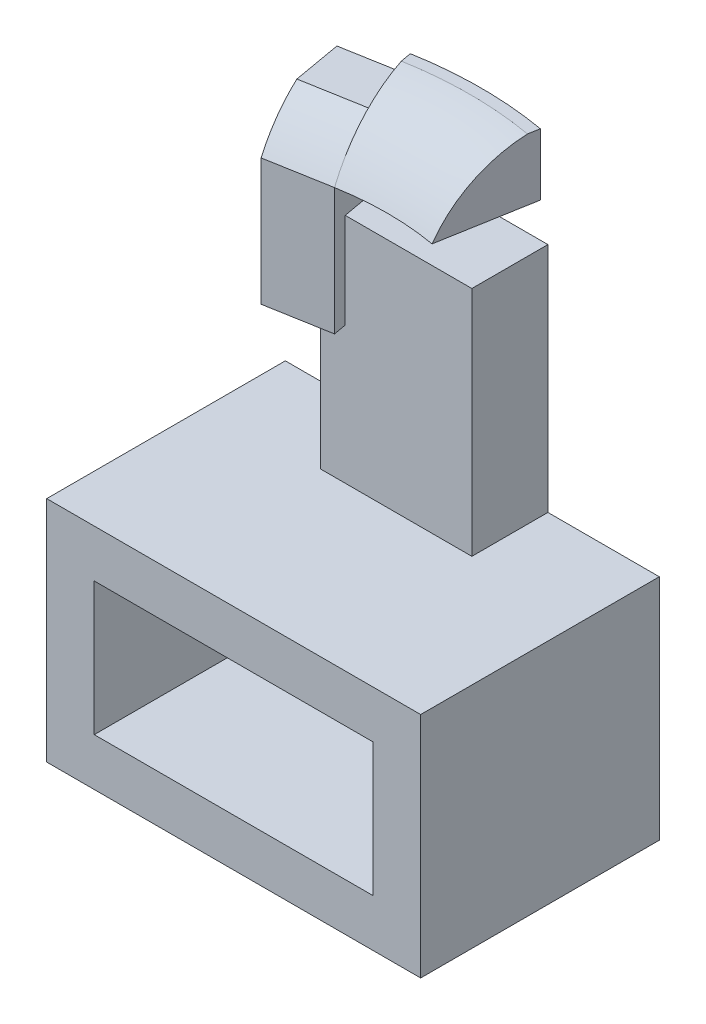
ISO-10303-21;
HEADER;
FILE_DESCRIPTION(('STEP AP214'),'2;1');
FILE_NAME('part.step','',(''),(''),'','','');
FILE_SCHEMA(('AUTOMOTIVE_DESIGN { 1 0 10303 214 1 1 1 1 }'));
ENDSEC;
DATA;
#1=APPLICATION_CONTEXT('core data for automotive mechanical design processes');
#2=APPLICATION_PROTOCOL_DEFINITION('international standard','automotive_design',2000,#1);
#3=PRODUCT_CONTEXT('',#1,'mechanical');
#4=PRODUCT('Part','Part','',(#3));
#5=PRODUCT_RELATED_PRODUCT_CATEGORY('part','',(#4));
#6=PRODUCT_DEFINITION_FORMATION('','',#4);
#7=PRODUCT_DEFINITION_CONTEXT('part definition',#1,'design');
#8=PRODUCT_DEFINITION('design','',#6,#7);
#9=PRODUCT_DEFINITION_SHAPE('','',#8);
#10=(LENGTH_UNIT() NAMED_UNIT(*) SI_UNIT(.MILLI.,.METRE.));
#11=(NAMED_UNIT(*) PLANE_ANGLE_UNIT() SI_UNIT($,.RADIAN.));
#12=(NAMED_UNIT(*) SI_UNIT($,.STERADIAN.) SOLID_ANGLE_UNIT());
#13=UNCERTAINTY_MEASURE_WITH_UNIT(LENGTH_MEASURE(1.E-05),#10,'distance_accuracy_value','');
#14=(GEOMETRIC_REPRESENTATION_CONTEXT(3) GLOBAL_UNCERTAINTY_ASSIGNED_CONTEXT((#13)) GLOBAL_UNIT_ASSIGNED_CONTEXT((#10,
#11,#12)) REPRESENTATION_CONTEXT('',''));
#15=CARTESIAN_POINT('',(0.,0.,0.));
#16=DIRECTION('',(0.,0.,1.));
#17=DIRECTION('',(1.,0.,0.));
#18=AXIS2_PLACEMENT_3D('',#15,#16,#17);
#19=CARTESIAN_POINT('',(0.,0.,-5.));
#20=DIRECTION('',(0.,0.,1.));
#21=DIRECTION('',(1.,0.,0.));
#22=AXIS2_PLACEMENT_3D('',#19,#20,#21);
#23=PLANE('',#22);
#24=DIRECTION('',(-1.,0.,0.));
#25=VECTOR('',#24,1.);
#26=CARTESIAN_POINT('',(0.,39.6,-5.));
#27=LINE('',#26,#25);
#28=CARTESIAN_POINT('',(-10.1705402472643,39.6,-5.));
#29=VERTEX_POINT('',#28);
#30=CARTESIAN_POINT('',(-11.927556156706,39.6,-5.));
#31=VERTEX_POINT('',#30);
#32=EDGE_CURVE('E312',#29,#31,#27,.T.);
#33=ORIENTED_EDGE('',*,*,#32,.F.);
#34=DIRECTION('',(0.,-1.,0.));
#35=VECTOR('',#34,1.);
#36=CARTESIAN_POINT('',(-10.1705402472643,0.,-5.));
#37=LINE('',#36,#35);
#38=CARTESIAN_POINT('',(-10.1705402472643,54.6,-5.));
#39=VERTEX_POINT('',#38);
#40=EDGE_CURVE('E308',#39,#29,#37,.T.);
#41=ORIENTED_EDGE('',*,*,#40,.F.);
#42=DIRECTION('',(-1.,0.,0.));
#43=VECTOR('',#42,1.);
#44=CARTESIAN_POINT('',(11.927556156706,54.6,-5.00000000000001));
#45=LINE('',#44,#43);
#46=CARTESIAN_POINT('',(11.927556156706,54.6,-5.00000000000001));
#47=VERTEX_POINT('',#46);
#48=EDGE_CURVE('E320',#47,#39,#45,.T.);
#49=ORIENTED_EDGE('',*,*,#48,.F.);
#50=DIRECTION('',(0.,-1.,0.));
#51=VECTOR('',#50,1.);
#52=CARTESIAN_POINT('',(11.927556156706,54.6,-5.00000000000001));
#53=LINE('',#52,#51);
#54=CARTESIAN_POINT('',(11.927556156706,18.,-5.));
#55=VERTEX_POINT('',#54);
#56=EDGE_CURVE('E330',#47,#55,#53,.T.);
#57=ORIENTED_EDGE('',*,*,#56,.T.);
#58=DIRECTION('',(1.,0.,0.));
#59=VECTOR('',#58,1.);
#60=CARTESIAN_POINT('',(0.,18.,-5.));
#61=LINE('',#60,#59);
#62=CARTESIAN_POINT('',(29.5,18.,-5.));
#63=VERTEX_POINT('',#62);
#64=EDGE_CURVE('E342',#55,#63,#61,.T.);
#65=ORIENTED_EDGE('',*,*,#64,.T.);
#66=DIRECTION('',(0.,-1.,0.));
#67=VECTOR('',#66,1.);
#68=CARTESIAN_POINT('',(29.5,0.,-5.));
#69=LINE('',#68,#67);
#70=CARTESIAN_POINT('',(29.5,-18.,-5.));
#71=VERTEX_POINT('',#70);
#72=EDGE_CURVE('E339',#63,#71,#69,.T.);
#73=ORIENTED_EDGE('',*,*,#72,.T.);
#74=DIRECTION('',(1.,0.,0.));
#75=VECTOR('',#74,1.);
#76=CARTESIAN_POINT('',(0.,-18.,-5.));
#77=LINE('',#76,#75);
#78=CARTESIAN_POINT('',(-29.5,-18.,-5.));
#79=VERTEX_POINT('',#78);
#80=EDGE_CURVE('E349',#79,#71,#77,.T.);
#81=ORIENTED_EDGE('',*,*,#80,.F.);
#82=DIRECTION('',(0.,-1.,0.));
#83=VECTOR('',#82,1.);
#84=CARTESIAN_POINT('',(-29.5,0.,-5.));
#85=LINE('',#84,#83);
#86=CARTESIAN_POINT('',(-29.5,18.,-5.));
#87=VERTEX_POINT('',#86);
#88=EDGE_CURVE('E346',#87,#79,#85,.T.);
#89=ORIENTED_EDGE('',*,*,#88,.F.);
#90=CARTESIAN_POINT('',(-11.927556156706,18.,-5.));
#91=VERTEX_POINT('',#90);
#92=EDGE_CURVE('E343',#87,#91,#61,.T.);
#93=ORIENTED_EDGE('',*,*,#92,.T.);
#94=DIRECTION('',(0.,-1.,0.));
#95=VECTOR('',#94,1.);
#96=CARTESIAN_POINT('',(-11.927556156706,54.6,-5.));
#97=LINE('',#96,#95);
#98=EDGE_CURVE('E323',#31,#91,#97,.T.);
#99=ORIENTED_EDGE('',*,*,#98,.F.);
#100=EDGE_LOOP('',(#33,#41,#49,#57,#65,#73,#81,#89,#93,#99));
#101=FACE_BOUND('',#100,.T.);
#102=ADVANCED_FACE('F37',(#101),#23,.F.);
#103=CARTESIAN_POINT('',(-11.927556156706,54.6,7.));
#104=DIRECTION('',(1.,0.,0.));
#105=DIRECTION('',(0.,0.,-1.));
#106=AXIS2_PLACEMENT_3D('',#103,#104,#105);
#107=PLANE('',#106);
#108=DIRECTION('',(0.,0.,1.));
#109=VECTOR('',#108,1.);
#110=CARTESIAN_POINT('',(-11.927556156706,39.6,7.));
#111=LINE('',#110,#109);
#112=CARTESIAN_POINT('',(-11.927556156706,39.6,7.));
#113=VERTEX_POINT('',#112);
#114=EDGE_CURVE('E310',#31,#113,#111,.T.);
#115=ORIENTED_EDGE('',*,*,#114,.F.);
#116=ORIENTED_EDGE('',*,*,#98,.T.);
#117=DIRECTION('',(0.,0.,1.));
#118=VECTOR('',#117,1.);
#119=CARTESIAN_POINT('',(-11.927556156706,18.,7.));
#120=LINE('',#119,#118);
#121=CARTESIAN_POINT('',(-11.927556156706,18.,7.));
#122=VERTEX_POINT('',#121);
#123=EDGE_CURVE('E314',#91,#122,#120,.T.);
#124=ORIENTED_EDGE('',*,*,#123,.T.);
#125=DIRECTION('',(0.,-1.,0.));
#126=VECTOR('',#125,1.);
#127=CARTESIAN_POINT('',(-11.927556156706,54.6,7.));
#128=LINE('',#127,#126);
#129=EDGE_CURVE('E336',#113,#122,#128,.T.);
#130=ORIENTED_EDGE('',*,*,#129,.F.);
#131=EDGE_LOOP('',(#115,#116,#124,#130));
#132=FACE_BOUND('',#131,.T.);
#133=ADVANCED_FACE('F392',(#132),#107,.F.);
#134=CARTESIAN_POINT('',(11.927556156706,54.6,6.99999999999999));
#135=DIRECTION('',(0.,0.,-1.));
#136=DIRECTION('',(-1.,0.,0.));
#137=AXIS2_PLACEMENT_3D('',#134,#135,#136);
#138=PLANE('',#137);
#139=DIRECTION('',(1.,0.,0.));
#140=VECTOR('',#139,1.);
#141=CARTESIAN_POINT('',(11.927556156706,39.6,6.99999999999999));
#142=LINE('',#141,#140);
#143=CARTESIAN_POINT('',(-8.0546164787627,39.6,7.));
#144=VERTEX_POINT('',#143);
#145=EDGE_CURVE('E45',#113,#144,#142,.T.);
#146=ORIENTED_EDGE('',*,*,#145,.F.);
#147=ORIENTED_EDGE('',*,*,#129,.T.);
#148=DIRECTION('',(1.,0.,0.));
#149=VECTOR('',#148,1.);
#150=CARTESIAN_POINT('',(11.927556156706,18.,6.99999999999999));
#151=LINE('',#150,#149);
#152=CARTESIAN_POINT('',(11.927556156706,18.,6.99999999999999));
#153=VERTEX_POINT('',#152);
#154=EDGE_CURVE('E325',#122,#153,#151,.T.);
#155=ORIENTED_EDGE('',*,*,#154,.T.);
#156=DIRECTION('',(0.,-1.,0.));
#157=VECTOR('',#156,1.);
#158=CARTESIAN_POINT('',(11.927556156706,54.6,6.99999999999999));
#159=LINE('',#158,#157);
#160=CARTESIAN_POINT('',(11.927556156706,54.6,6.99999999999999));
#161=VERTEX_POINT('',#160);
#162=EDGE_CURVE('E333',#161,#153,#159,.T.);
#163=ORIENTED_EDGE('',*,*,#162,.F.);
#164=DIRECTION('',(1.,0.,0.));
#165=VECTOR('',#164,1.);
#166=CARTESIAN_POINT('',(11.927556156706,54.6,6.99999999999999));
#167=LINE('',#166,#165);
#168=CARTESIAN_POINT('',(-8.0546164787627,54.6,7.));
#169=VERTEX_POINT('',#168);
#170=EDGE_CURVE('E315',#169,#161,#167,.T.);
#171=ORIENTED_EDGE('',*,*,#170,.F.);
#172=DIRECTION('',(0.,1.,0.));
#173=VECTOR('',#172,1.);
#174=CARTESIAN_POINT('',(-8.05461647876271,54.6,7.));
#175=LINE('',#174,#173);
#176=EDGE_CURVE('E306',#144,#169,#175,.T.);
#177=ORIENTED_EDGE('',*,*,#176,.F.);
#178=EDGE_LOOP('',(#146,#147,#155,#163,#171,#177));
#179=FACE_BOUND('',#178,.T.);
#180=ADVANCED_FACE('F379',(#179),#138,.F.);
#181=CARTESIAN_POINT('',(0.,54.6,0.));
#182=DIRECTION('',(0.,1.,0.));
#183=DIRECTION('',(0.,0.,1.));
#184=AXIS2_PLACEMENT_3D('',#181,#182,#183);
#185=PLANE('',#184);
#186=ORIENTED_EDGE('',*,*,#48,.T.);
#187=DIRECTION('',(0.173648177666931,0.,0.984807753012208));
#188=VECTOR('',#187,1.);
#189=CARTESIAN_POINT('',(-9.00881057519814,54.6,1.58849636849918));
#190=LINE('',#189,#188);
#191=EDGE_CURVE('E363',#39,#169,#190,.T.);
#192=ORIENTED_EDGE('',*,*,#191,.T.);
#193=ORIENTED_EDGE('',*,*,#170,.T.);
#194=DIRECTION('',(0.,0.,-1.));
#195=VECTOR('',#194,1.);
#196=CARTESIAN_POINT('',(11.927556156706,54.6,6.99999999999999));
#197=LINE('',#196,#195);
#198=EDGE_CURVE('E317',#161,#47,#197,.T.);
#199=ORIENTED_EDGE('',*,*,#198,.T.);
#200=EDGE_LOOP('',(#186,#192,#193,#199));
#201=FACE_BOUND('',#200,.T.);
#202=ADVANCED_FACE('F383',(#201),#185,.T.);
#203=CARTESIAN_POINT('',(-29.5,18.,10.));
#204=DIRECTION('',(0.,-1.,0.));
#205=DIRECTION('',(0.,0.,-1.));
#206=AXIS2_PLACEMENT_3D('',#203,#204,#205);
#207=PLANE('',#206);
#208=ORIENTED_EDGE('',*,*,#92,.F.);
#209=DIRECTION('',(0.,0.,-1.));
#210=VECTOR('',#209,1.);
#211=CARTESIAN_POINT('',(-29.5,18.,10.));
#212=LINE('',#211,#210);
#213=CARTESIAN_POINT('',(-29.5,18.,32.65));
#214=VERTEX_POINT('',#213);
#215=EDGE_CURVE('E197',#214,#87,#212,.T.);
#216=ORIENTED_EDGE('',*,*,#215,.F.);
#217=DIRECTION('',(1.,0.,0.));
#218=VECTOR('',#217,1.);
#219=CARTESIAN_POINT('',(0.,18.,32.65));
#220=LINE('',#219,#218);
#221=CARTESIAN_POINT('',(29.5,18.,32.65));
#222=VERTEX_POINT('',#221);
#223=EDGE_CURVE('E223',#214,#222,#220,.T.);
#224=ORIENTED_EDGE('',*,*,#223,.T.);
#225=DIRECTION('',(0.,0.,-1.));
#226=VECTOR('',#225,1.);
#227=CARTESIAN_POINT('',(29.5,18.,10.));
#228=LINE('',#227,#226);
#229=EDGE_CURVE('E357',#222,#63,#228,.T.);
#230=ORIENTED_EDGE('',*,*,#229,.T.);
#231=ORIENTED_EDGE('',*,*,#64,.F.);
#232=DIRECTION('',(0.,0.,-1.));
#233=VECTOR('',#232,1.);
#234=CARTESIAN_POINT('',(11.927556156706,18.,6.99999999999999));
#235=LINE('',#234,#233);
#236=EDGE_CURVE('E318',#153,#55,#235,.T.);
#237=ORIENTED_EDGE('',*,*,#236,.F.);
#238=ORIENTED_EDGE('',*,*,#154,.F.);
#239=ORIENTED_EDGE('',*,*,#123,.F.);
#240=EDGE_LOOP('',(#208,#216,#224,#230,#231,#237,#238,#239));
#241=FACE_BOUND('',#240,.T.);
#242=ADVANCED_FACE('F397',(#241),#207,.F.);
#243=CARTESIAN_POINT('',(-29.5,18.,10.));
#244=DIRECTION('',(1.,0.,0.));
#245=DIRECTION('',(0.,1.,0.));
#246=AXIS2_PLACEMENT_3D('',#243,#244,#245);
#247=PLANE('',#246);
#248=ORIENTED_EDGE('',*,*,#88,.T.);
#249=DIRECTION('',(0.,0.,-1.));
#250=VECTOR('',#249,1.);
#251=CARTESIAN_POINT('',(-29.5,-18.,10.));
#252=LINE('',#251,#250);
#253=CARTESIAN_POINT('',(-29.5,-18.,32.65));
#254=VERTEX_POINT('',#253);
#255=EDGE_CURVE('E361',#254,#79,#252,.T.);
#256=ORIENTED_EDGE('',*,*,#255,.F.);
#257=DIRECTION('',(0.,1.,0.));
#258=VECTOR('',#257,1.);
#259=CARTESIAN_POINT('',(-29.5,0.,32.65));
#260=LINE('',#259,#258);
#261=EDGE_CURVE('E220',#254,#214,#260,.T.);
#262=ORIENTED_EDGE('',*,*,#261,.T.);
#263=ORIENTED_EDGE('',*,*,#215,.T.);
#264=EDGE_LOOP('',(#248,#256,#262,#263));
#265=FACE_BOUND('',#264,.T.);
#266=ADVANCED_FACE('F39',(#265),#247,.F.);
#267=CARTESIAN_POINT('',(-29.5,-18.,10.));
#268=DIRECTION('',(0.,1.,0.));
#269=DIRECTION('',(0.,0.,1.));
#270=AXIS2_PLACEMENT_3D('',#267,#268,#269);
#271=PLANE('',#270);
#272=ORIENTED_EDGE('',*,*,#80,.T.);
#273=DIRECTION('',(0.,0.,-1.));
#274=VECTOR('',#273,1.);
#275=CARTESIAN_POINT('',(29.5,-18.,10.));
#276=LINE('',#275,#274);
#277=CARTESIAN_POINT('',(29.5,-18.,32.65));
#278=VERTEX_POINT('',#277);
#279=EDGE_CURVE('E359',#278,#71,#276,.T.);
#280=ORIENTED_EDGE('',*,*,#279,.F.);
#281=DIRECTION('',(-1.,0.,0.));
#282=VECTOR('',#281,1.);
#283=CARTESIAN_POINT('',(0.,-18.,32.65));
#284=LINE('',#283,#282);
#285=EDGE_CURVE('E217',#278,#254,#284,.T.);
#286=ORIENTED_EDGE('',*,*,#285,.T.);
#287=ORIENTED_EDGE('',*,*,#255,.T.);
#288=EDGE_LOOP('',(#272,#280,#286,#287));
#289=FACE_BOUND('',#288,.T.);
#290=ADVANCED_FACE('F409',(#289),#271,.F.);
#291=CARTESIAN_POINT('',(29.5,18.,10.));
#292=DIRECTION('',(-1.,0.,0.));
#293=DIRECTION('',(0.,-1.,0.));
#294=AXIS2_PLACEMENT_3D('',#291,#292,#293);
#295=PLANE('',#294);
#296=ORIENTED_EDGE('',*,*,#72,.F.);
#297=ORIENTED_EDGE('',*,*,#229,.F.);
#298=DIRECTION('',(0.,-1.,0.));
#299=VECTOR('',#298,1.);
#300=CARTESIAN_POINT('',(29.5,0.,32.65));
#301=LINE('',#300,#299);
#302=EDGE_CURVE('E226',#222,#278,#301,.T.);
#303=ORIENTED_EDGE('',*,*,#302,.T.);
#304=ORIENTED_EDGE('',*,*,#279,.T.);
#305=EDGE_LOOP('',(#296,#297,#303,#304));
#306=FACE_BOUND('',#305,.T.);
#307=ADVANCED_FACE('F405',(#306),#295,.F.);
#308=CARTESIAN_POINT('',(11.927556156706,54.6,6.99999999999999));
#309=DIRECTION('',(-1.,0.,0.));
#310=DIRECTION('',(0.,0.,1.));
#311=AXIS2_PLACEMENT_3D('',#308,#309,#310);
#312=PLANE('',#311);
#313=ORIENTED_EDGE('',*,*,#236,.T.);
#314=ORIENTED_EDGE('',*,*,#56,.F.);
#315=ORIENTED_EDGE('',*,*,#198,.F.);
#316=ORIENTED_EDGE('',*,*,#162,.T.);
#317=EDGE_LOOP('',(#313,#314,#315,#316));
#318=FACE_BOUND('',#317,.T.);
#319=ADVANCED_FACE('F401',(#318),#312,.F.);
#320=CARTESIAN_POINT('',(-18.8568881053202,39.6,3.32497814516849));
#321=DIRECTION('',(0.,1.,0.));
#322=DIRECTION('',(0.,0.,1.));
#323=AXIS2_PLACEMENT_3D('',#320,#321,#322);
#324=PLANE('',#323);
#325=DIRECTION('',(0.173648177666931,0.,0.984807753012208));
#326=VECTOR('',#325,1.);
#327=CARTESIAN_POINT('',(-9.00881057519814,39.6,1.58849636849918));
#328=LINE('',#327,#326);
#329=CARTESIAN_POINT('',(-10.2547931321206,39.6,-5.47782185413595));
#330=VERTEX_POINT('',#329);
#331=EDGE_CURVE('E249',#330,#29,#328,.T.);
#332=ORIENTED_EDGE('',*,*,#331,.T.);
#333=ORIENTED_EDGE('',*,*,#32,.T.);
#334=ORIENTED_EDGE('',*,*,#114,.T.);
#335=ORIENTED_EDGE('',*,*,#145,.T.);
#336=CARTESIAN_POINT('',(-7.69348251153337,39.6,9.04809250279412));
#337=VERTEX_POINT('',#336);
#338=EDGE_CURVE('E233',#144,#337,#328,.T.);
#339=ORIENTED_EDGE('',*,*,#338,.T.);
#340=DIRECTION('',(0.984807753012208,0.,-0.173648177666931));
#341=VECTOR('',#340,1.);
#342=CARTESIAN_POINT('',(-17.5415600416555,39.6,10.7845742794634));
#343=LINE('',#342,#341);
#344=CARTESIAN_POINT('',(-17.5415600416555,39.6,10.7845742794634));
#345=VERTEX_POINT('',#344);
#346=EDGE_CURVE('E270',#345,#337,#343,.T.);
#347=ORIENTED_EDGE('',*,*,#346,.F.);
#348=DIRECTION('',(0.173648177666931,0.,0.984807753012208));
#349=VECTOR('',#348,1.);
#350=CARTESIAN_POINT('',(-18.8568881053202,39.6,3.32497814516849));
#351=LINE('',#350,#349);
#352=CARTESIAN_POINT('',(-20.1028706622427,39.6,-3.74134007746664));
#353=VERTEX_POINT('',#352);
#354=EDGE_CURVE('E234',#353,#345,#351,.T.);
#355=ORIENTED_EDGE('',*,*,#354,.F.);
#356=DIRECTION('',(0.984807753012208,0.,-0.173648177666931));
#357=VECTOR('',#356,1.);
#358=CARTESIAN_POINT('',(-20.1028706622427,39.6,-3.74134007746664));
#359=LINE('',#358,#357);
#360=EDGE_CURVE('E248',#353,#330,#359,.T.);
#361=ORIENTED_EDGE('',*,*,#360,.T.);
#362=EDGE_LOOP('',(#332,#333,#334,#335,#339,#347,#355,#361));
#363=FACE_BOUND('',#362,.T.);
#364=ADVANCED_FACE('F368',(#363),#324,.F.);
#365=CARTESIAN_POINT('',(-9.00881057519814,0.,1.58849636849918));
#366=DIRECTION('',(-0.984807753012208,0.,0.173648177666931));
#367=DIRECTION('',(0.173648177666931,0.,0.984807753012208));
#368=AXIS2_PLACEMENT_3D('',#365,#366,#367);
#369=PLANE('',#368);
#370=ORIENTED_EDGE('',*,*,#191,.F.);
#371=ORIENTED_EDGE('',*,*,#40,.T.);
#372=ORIENTED_EDGE('',*,*,#331,.F.);
#373=DIRECTION('',(0.,-1.,0.));
#374=VECTOR('',#373,1.);
#375=CARTESIAN_POINT('',(-10.2547931321206,0.,-5.47782185413596));
#376=LINE('',#375,#374);
#377=CARTESIAN_POINT('',(-10.2547931321206,59.6,-5.47782185413595));
#378=VERTEX_POINT('',#377);
#379=EDGE_CURVE('E238',#378,#330,#376,.T.);
#380=ORIENTED_EDGE('',*,*,#379,.F.);
#381=DIRECTION('',(-0.173648177666931,0.,-0.984807753012208));
#382=VECTOR('',#381,1.);
#383=CARTESIAN_POINT('',(-10.2547931321206,59.6,-5.47782185413595));
#384=LINE('',#383,#382);
#385=CARTESIAN_POINT('',(-7.69348251153337,59.6,9.04809250279412));
#386=VERTEX_POINT('',#385);
#387=EDGE_CURVE('E295',#386,#378,#384,.T.);
#388=ORIENTED_EDGE('',*,*,#387,.F.);
#389=DIRECTION('',(0.,1.,0.));
#390=VECTOR('',#389,1.);
#391=CARTESIAN_POINT('',(-7.69348251153337,0.,9.04809250279412));
#392=LINE('',#391,#390);
#393=EDGE_CURVE('E252',#337,#386,#392,.T.);
#394=ORIENTED_EDGE('',*,*,#393,.F.);
#395=ORIENTED_EDGE('',*,*,#338,.F.);
#396=ORIENTED_EDGE('',*,*,#176,.T.);
#397=EDGE_LOOP('',(#370,#371,#372,#380,#388,#394,#395,#396));
#398=FACE_BOUND('',#397,.T.);
#399=ADVANCED_FACE('F376',(#398),#369,.F.);
#400=CARTESIAN_POINT('',(-10.6977316429036,50.0739583710066,-7.9898509775484));
#401=DIRECTION('',(-0.984807753012208,0.,0.173648177666931));
#402=DIRECTION('',(0.173648177666931,0.,0.984807753012208));
#403=AXIS2_PLACEMENT_3D('',#400,#401,#402);
#404=PLANE('',#403);
#405=DIRECTION('',(0.,1.,0.));
#406=VECTOR('',#405,1.);
#407=CARTESIAN_POINT('',(-10.2547931321206,59.6,-5.47782185413595));
#408=LINE('',#407,#406);
#409=CARTESIAN_POINT('',(-10.2547931321206,66.3439716286506,-5.47782185413595));
#410=VERTEX_POINT('',#409);
#411=CARTESIAN_POINT('',(-10.2547931321206,69.35,-5.47782185413595));
#412=VERTEX_POINT('',#411);
#413=EDGE_CURVE('E285',#410,#412,#408,.T.);
#414=ORIENTED_EDGE('',*,*,#413,.F.);
#415=DIRECTION('',(0.173648177666931,0.,0.984807753012208));
#416=VECTOR('',#415,1.);
#417=CARTESIAN_POINT('',(-9.00881057519814,66.3439716286506,1.58849636849918));
#418=LINE('',#417,#416);
#419=CARTESIAN_POINT('',(-8.90217330434275,66.3439716286506,2.19326638399495));
#420=VERTEX_POINT('',#419);
#421=EDGE_CURVE('E257',#410,#420,#418,.T.);
#422=ORIENTED_EDGE('',*,*,#421,.T.);
#423=CARTESIAN_POINT('',(-10.4653945744785,50.0885563828168,-6.67220198536581));
#424=DIRECTION('',(-0.984807753012208,0.,0.173648177666931));
#425=DIRECTION('',(0.173648177666931,0.,0.984807753012208));
#426=AXIS2_PLACEMENT_3D('',#423,#424,#425);
#427=CIRCLE('',#426,18.5816768608763);
#428=EDGE_CURVE('E254',#420,#386,#427,.F.);
#429=ORIENTED_EDGE('',*,*,#428,.T.);
#430=CARTESIAN_POINT('',(-10.6977316429036,50.0739583710066,-7.9898509775484));
#431=DIRECTION('',(0.984807753012208,0.,-0.173648177666931));
#432=DIRECTION('',(0.173648177666931,0.,0.984807753012208));
#433=AXIS2_PLACEMENT_3D('',#430,#431,#432);
#434=CIRCLE('',#433,19.75);
#435=CARTESIAN_POINT('',(-9.95090882120347,69.35,-3.75440828636459));
#436=VERTEX_POINT('',#435);
#437=EDGE_CURVE('E292',#436,#386,#434,.T.);
#438=ORIENTED_EDGE('',*,*,#437,.F.);
#439=DIRECTION('',(0.173648177666931,0.,0.984807753012208));
#440=VECTOR('',#439,1.);
#441=CARTESIAN_POINT('',(-10.2547931321206,69.35,-5.47782185413595));
#442=LINE('',#441,#440);
#443=EDGE_CURVE('E289',#412,#436,#442,.T.);
#444=ORIENTED_EDGE('',*,*,#443,.F.);
#445=EDGE_LOOP('',(#414,#422,#429,#438,#444));
#446=FACE_BOUND('',#445,.T.);
#447=ADVANCED_FACE('F587',(#446),#404,.T.);
#448=CARTESIAN_POINT('',(0.,-41.3962676693913,52.68));
#449=DIRECTION('',(0.,-1.,0.));
#450=DIRECTION('',(0.,0.,-1.));
#451=AXIS2_PLACEMENT_3D('',#448,#449,#450);
#452=CYLINDRICAL_SURFACE('',#451,59.055);
#453=CARTESIAN_POINT('',(0.,59.6,52.68));
#454=DIRECTION('',(0.,-1.,0.));
#455=DIRECTION('',(0.,0.,-1.));
#456=AXIS2_PLACEMENT_3D('',#453,#454,#455);
#457=CIRCLE('',#456,59.055);
#458=CARTESIAN_POINT('',(10.2547931321206,59.6,-5.47782185413595));
#459=VERTEX_POINT('',#458);
#460=EDGE_CURVE('E304',#378,#459,#457,.T.);
#461=ORIENTED_EDGE('',*,*,#460,.F.);
#462=EDGE_CURVE('E286',#378,#410,#408,.T.);
#463=ORIENTED_EDGE('',*,*,#462,.T.);
#464=ORIENTED_EDGE('',*,*,#413,.T.);
#465=CARTESIAN_POINT('',(0.,69.35,52.68));
#466=DIRECTION('',(0.,-1.,0.));
#467=DIRECTION('',(0.,0.,-1.));
#468=AXIS2_PLACEMENT_3D('',#465,#466,#467);
#469=CIRCLE('',#468,59.055);
#470=CARTESIAN_POINT('',(10.2547931321206,69.35,-5.47782185413595));
#471=VERTEX_POINT('',#470);
#472=EDGE_CURVE('E298',#412,#471,#469,.T.);
#473=ORIENTED_EDGE('',*,*,#472,.T.);
#474=DIRECTION('',(0.,1.,0.));
#475=VECTOR('',#474,1.);
#476=CARTESIAN_POINT('',(10.2547931321206,59.6,-5.47782185413595));
#477=LINE('',#476,#475);
#478=EDGE_CURVE('E273',#459,#471,#477,.T.);
#479=ORIENTED_EDGE('',*,*,#478,.F.);
#480=EDGE_LOOP('',(#461,#463,#464,#473,#479));
#481=FACE_BOUND('',#480,.T.);
#482=ADVANCED_FACE('F598',(#481),#452,.T.);
#483=CARTESIAN_POINT('',(-10.2547931321206,59.6,-5.47782185413595));
#484=DIRECTION('',(0.,-1.,0.));
#485=DIRECTION('',(0.,0.,-1.));
#486=AXIS2_PLACEMENT_3D('',#483,#484,#485);
#487=PLANE('',#486);
#488=CARTESIAN_POINT('',(0.,59.6,52.68));
#489=DIRECTION('',(0.,-1.,0.));
#490=DIRECTION('',(0.,0.,-1.));
#491=AXIS2_PLACEMENT_3D('',#488,#489,#490);
#492=CIRCLE('',#491,44.305);
#493=CARTESIAN_POINT('',(7.69348251153337,59.6,9.04809250279412));
#494=VERTEX_POINT('',#493);
#495=EDGE_CURVE('E302',#386,#494,#492,.T.);
#496=ORIENTED_EDGE('',*,*,#495,.F.);
#497=ORIENTED_EDGE('',*,*,#387,.T.);
#498=ORIENTED_EDGE('',*,*,#460,.T.);
#499=DIRECTION('',(0.173648177666931,0.,-0.984807753012208));
#500=VECTOR('',#499,1.);
#501=CARTESIAN_POINT('',(10.2547931321206,59.6,-5.47782185413595));
#502=LINE('',#501,#500);
#503=EDGE_CURVE('E282',#494,#459,#502,.T.);
#504=ORIENTED_EDGE('',*,*,#503,.F.);
#505=EDGE_LOOP('',(#496,#497,#498,#504));
#506=FACE_BOUND('',#505,.T.);
#507=ADVANCED_FACE('F608',(#506),#487,.T.);
#508=CARTESIAN_POINT('',(0.,50.0739583710066,52.68));
#509=DIRECTION('',(0.,-1.,0.));
#510=DIRECTION('',(0.,0.,-1.));
#511=AXIS2_PLACEMENT_3D('',#508,#509,#510);
#512=TOROIDAL_SURFACE('',#511,61.605781221745,19.75);
#513=CARTESIAN_POINT('',(0.,69.35,52.68));
#514=DIRECTION('',(0.,-1.,0.));
#515=DIRECTION('',(0.,0.,-1.));
#516=AXIS2_PLACEMENT_3D('',#513,#514,#515);
#517=CIRCLE('',#516,57.305);
#518=CARTESIAN_POINT('',(9.95090882120347,69.35,-3.75440828636459));
#519=VERTEX_POINT('',#518);
#520=EDGE_CURVE('E300',#436,#519,#517,.T.);
#521=ORIENTED_EDGE('',*,*,#520,.F.);
#522=ORIENTED_EDGE('',*,*,#437,.T.);
#523=ORIENTED_EDGE('',*,*,#495,.T.);
#524=CARTESIAN_POINT('',(10.6977316429036,50.0739583710066,-7.9898509775484));
#525=DIRECTION('',(0.984807753012208,0.,0.173648177666931));
#526=DIRECTION('',(-0.173648177666931,0.,0.984807753012208));
#527=AXIS2_PLACEMENT_3D('',#524,#525,#526);
#528=CIRCLE('',#527,19.75);
#529=EDGE_CURVE('E279',#519,#494,#528,.T.);
#530=ORIENTED_EDGE('',*,*,#529,.F.);
#531=EDGE_LOOP('',(#521,#522,#523,#530));
#532=FACE_BOUND('',#531,.T.);
#533=ADVANCED_FACE('F618',(#532),#512,.T.);
#534=CARTESIAN_POINT('',(-10.2547931321206,69.35,-5.47782185413595));
#535=DIRECTION('',(0.,1.,0.));
#536=DIRECTION('',(0.,0.,1.));
#537=AXIS2_PLACEMENT_3D('',#534,#535,#536);
#538=PLANE('',#537);
#539=ORIENTED_EDGE('',*,*,#443,.T.);
#540=ORIENTED_EDGE('',*,*,#520,.T.);
#541=DIRECTION('',(-0.173648177666931,0.,0.984807753012208));
#542=VECTOR('',#541,1.);
#543=CARTESIAN_POINT('',(10.2547931321206,69.35,-5.47782185413595));
#544=LINE('',#543,#542);
#545=EDGE_CURVE('E276',#471,#519,#544,.T.);
#546=ORIENTED_EDGE('',*,*,#545,.F.);
#547=ORIENTED_EDGE('',*,*,#472,.F.);
#548=EDGE_LOOP('',(#539,#540,#546,#547));
#549=FACE_BOUND('',#548,.T.);
#550=ADVANCED_FACE('F627',(#549),#538,.T.);
#551=CARTESIAN_POINT('',(10.6977316429036,50.0739583710066,-7.9898509775484));
#552=DIRECTION('',(-0.984807753012208,0.,-0.173648177666931));
#553=DIRECTION('',(-0.173648177666931,0.,0.984807753012208));
#554=AXIS2_PLACEMENT_3D('',#551,#552,#553);
#555=PLANE('',#554);
#556=ORIENTED_EDGE('',*,*,#478,.T.);
#557=ORIENTED_EDGE('',*,*,#545,.T.);
#558=ORIENTED_EDGE('',*,*,#529,.T.);
#559=ORIENTED_EDGE('',*,*,#503,.T.);
#560=EDGE_LOOP('',(#556,#557,#558,#559));
#561=FACE_BOUND('',#560,.T.);
#562=ADVANCED_FACE('F637',(#561),#555,.F.);
#563=CARTESIAN_POINT('',(-17.5415600416555,0.,10.7845742794634));
#564=DIRECTION('',(-0.173648177666931,0.,-0.984807753012208));
#565=DIRECTION('',(-0.984807753012208,0.,0.173648177666931));
#566=AXIS2_PLACEMENT_3D('',#563,#564,#565);
#567=PLANE('',#566);
#568=ORIENTED_EDGE('',*,*,#393,.T.);
#569=DIRECTION('',(0.984807753012208,0.,-0.173648177666931));
#570=VECTOR('',#569,1.);
#571=CARTESIAN_POINT('',(-17.5415600416555,59.6,10.7845742794634));
#572=LINE('',#571,#570);
#573=CARTESIAN_POINT('',(-17.5415600416555,59.6,10.7845742794634));
#574=VERTEX_POINT('',#573);
#575=EDGE_CURVE('E267',#574,#386,#572,.T.);
#576=ORIENTED_EDGE('',*,*,#575,.F.);
#577=DIRECTION('',(0.,1.,0.));
#578=VECTOR('',#577,1.);
#579=CARTESIAN_POINT('',(-17.5415600416555,0.,10.7845742794634));
#580=LINE('',#579,#578);
#581=EDGE_CURVE('E237',#345,#574,#580,.T.);
#582=ORIENTED_EDGE('',*,*,#581,.F.);
#583=ORIENTED_EDGE('',*,*,#346,.T.);
#584=EDGE_LOOP('',(#568,#576,#582,#583));
#585=FACE_BOUND('',#584,.T.);
#586=ADVANCED_FACE('F647',(#585),#567,.F.);
#587=CARTESIAN_POINT('',(-20.3134721046006,50.0885563828168,-4.9357202086965));
#588=DIRECTION('',(0.984807753012208,0.,-0.173648177666931));
#589=DIRECTION('',(-0.173648177666931,0.,-0.984807753012208));
#590=AXIS2_PLACEMENT_3D('',#587,#588,#589);
#591=CYLINDRICAL_SURFACE('',#590,18.5816768608763);
#592=ORIENTED_EDGE('',*,*,#428,.F.);
#593=DIRECTION('',(0.984807753012208,0.,-0.173648177666931));
#594=VECTOR('',#593,1.);
#595=CARTESIAN_POINT('',(-18.7502508344648,66.3439716286506,3.92974816066426));
#596=LINE('',#595,#594);
#597=CARTESIAN_POINT('',(-18.7502508344648,66.3439716286506,3.92974816066426));
#598=VERTEX_POINT('',#597);
#599=EDGE_CURVE('E265',#598,#420,#596,.T.);
#600=ORIENTED_EDGE('',*,*,#599,.F.);
#601=CARTESIAN_POINT('',(-20.3134721046006,50.0885563828168,-4.9357202086965));
#602=DIRECTION('',(-0.984807753012208,0.,0.173648177666931));
#603=DIRECTION('',(0.173648177666931,0.,0.984807753012208));
#604=AXIS2_PLACEMENT_3D('',#601,#602,#603);
#605=CIRCLE('',#604,18.5816768608763);
#606=EDGE_CURVE('E240',#598,#574,#605,.F.);
#607=ORIENTED_EDGE('',*,*,#606,.T.);
#608=ORIENTED_EDGE('',*,*,#575,.T.);
#609=EDGE_LOOP('',(#592,#600,#607,#608));
#610=FACE_BOUND('',#609,.T.);
#611=ADVANCED_FACE('F657',(#610),#591,.T.);
#612=CARTESIAN_POINT('',(-18.8568881053202,66.3439716286506,3.32497814516849));
#613=DIRECTION('',(0.,1.,0.));
#614=DIRECTION('',(0.,0.,1.));
#615=AXIS2_PLACEMENT_3D('',#612,#613,#614);
#616=PLANE('',#615);
#617=ORIENTED_EDGE('',*,*,#421,.F.);
#618=DIRECTION('',(0.984807753012208,0.,-0.173648177666931));
#619=VECTOR('',#618,1.);
#620=CARTESIAN_POINT('',(-20.1028706622427,66.3439716286506,-3.74134007746664));
#621=LINE('',#620,#619);
#622=CARTESIAN_POINT('',(-20.1028706622427,66.3439716286506,-3.74134007746664));
#623=VERTEX_POINT('',#622);
#624=EDGE_CURVE('E263',#623,#410,#621,.T.);
#625=ORIENTED_EDGE('',*,*,#624,.F.);
#626=DIRECTION('',(0.173648177666931,0.,0.984807753012208));
#627=VECTOR('',#626,1.);
#628=CARTESIAN_POINT('',(-18.8568881053202,66.3439716286506,3.32497814516849));
#629=LINE('',#628,#627);
#630=EDGE_CURVE('E243',#623,#598,#629,.T.);
#631=ORIENTED_EDGE('',*,*,#630,.T.);
#632=ORIENTED_EDGE('',*,*,#599,.T.);
#633=EDGE_LOOP('',(#617,#625,#631,#632));
#634=FACE_BOUND('',#633,.T.);
#635=ADVANCED_FACE('F667',(#634),#616,.T.);
#636=CARTESIAN_POINT('',(-20.1028706622427,0.,-3.74134007746665));
#637=DIRECTION('',(0.173648177666931,0.,0.984807753012208));
#638=DIRECTION('',(0.984807753012208,0.,-0.173648177666931));
#639=AXIS2_PLACEMENT_3D('',#636,#637,#638);
#640=PLANE('',#639);
#641=ORIENTED_EDGE('',*,*,#462,.F.);
#642=ORIENTED_EDGE('',*,*,#379,.T.);
#643=ORIENTED_EDGE('',*,*,#360,.F.);
#644=DIRECTION('',(0.,-1.,0.));
#645=VECTOR('',#644,1.);
#646=CARTESIAN_POINT('',(-20.1028706622427,0.,-3.74134007746665));
#647=LINE('',#646,#645);
#648=EDGE_CURVE('E246',#623,#353,#647,.T.);
#649=ORIENTED_EDGE('',*,*,#648,.F.);
#650=ORIENTED_EDGE('',*,*,#624,.T.);
#651=EDGE_LOOP('',(#641,#642,#643,#649,#650));
#652=FACE_BOUND('',#651,.T.);
#653=ADVANCED_FACE('F677',(#652),#640,.F.);
#654=CARTESIAN_POINT('',(-18.8568881053202,0.,3.32497814516849));
#655=DIRECTION('',(-0.984807753012208,0.,0.173648177666931));
#656=DIRECTION('',(0.173648177666931,0.,0.984807753012208));
#657=AXIS2_PLACEMENT_3D('',#654,#655,#656);
#658=PLANE('',#657);
#659=ORIENTED_EDGE('',*,*,#354,.T.);
#660=ORIENTED_EDGE('',*,*,#581,.T.);
#661=ORIENTED_EDGE('',*,*,#606,.F.);
#662=ORIENTED_EDGE('',*,*,#630,.F.);
#663=ORIENTED_EDGE('',*,*,#648,.T.);
#664=EDGE_LOOP('',(#659,#660,#661,#662,#663));
#665=FACE_BOUND('',#664,.T.);
#666=ADVANCED_FACE('F493',(#665),#658,.T.);
#667=CARTESIAN_POINT('',(0.,0.,32.65));
#668=DIRECTION('',(0.,0.,-1.));
#669=DIRECTION('',(-1.,0.,0.));
#670=AXIS2_PLACEMENT_3D('',#667,#668,#669);
#671=PLANE('',#670);
#672=DIRECTION('',(0.,-1.,0.));
#673=VECTOR('',#672,1.);
#674=CARTESIAN_POINT('',(22.,0.,32.65));
#675=LINE('',#674,#673);
#676=CARTESIAN_POINT('',(22.,10.5,32.65));
#677=VERTEX_POINT('',#676);
#678=CARTESIAN_POINT('',(22.,-10.5,32.65));
#679=VERTEX_POINT('',#678);
#680=EDGE_CURVE('E212',#677,#679,#675,.T.);
#681=ORIENTED_EDGE('',*,*,#680,.T.);
#682=DIRECTION('',(-1.,0.,0.));
#683=VECTOR('',#682,1.);
#684=CARTESIAN_POINT('',(0.,-10.5,32.65));
#685=LINE('',#684,#683);
#686=CARTESIAN_POINT('',(-22.,-10.5,32.65));
#687=VERTEX_POINT('',#686);
#688=EDGE_CURVE('E192',#679,#687,#685,.T.);
#689=ORIENTED_EDGE('',*,*,#688,.T.);
#690=DIRECTION('',(0.,1.,0.));
#691=VECTOR('',#690,1.);
#692=CARTESIAN_POINT('',(-22.,0.,32.65));
#693=LINE('',#692,#691);
#694=CARTESIAN_POINT('',(-22.,10.5,32.65));
#695=VERTEX_POINT('',#694);
#696=EDGE_CURVE('E201',#687,#695,#693,.T.);
#697=ORIENTED_EDGE('',*,*,#696,.T.);
#698=DIRECTION('',(1.,0.,0.));
#699=VECTOR('',#698,1.);
#700=CARTESIAN_POINT('',(0.,10.5,32.65));
#701=LINE('',#700,#699);
#702=EDGE_CURVE('E207',#695,#677,#701,.T.);
#703=ORIENTED_EDGE('',*,*,#702,.T.);
#704=EDGE_LOOP('',(#681,#689,#697,#703));
#705=FACE_BOUND('',#704,.T.);
#706=ORIENTED_EDGE('',*,*,#285,.F.);
#707=ORIENTED_EDGE('',*,*,#302,.F.);
#708=ORIENTED_EDGE('',*,*,#223,.F.);
#709=ORIENTED_EDGE('',*,*,#261,.F.);
#710=EDGE_LOOP('',(#706,#707,#708,#709));
#711=FACE_BOUND('',#710,.T.);
#712=ADVANCED_FACE('F209',(#705,#711),#671,.F.);
#713=CARTESIAN_POINT('',(0.,0.,7.65));
#714=DIRECTION('',(0.,0.,1.));
#715=DIRECTION('',(1.,0.,0.));
#716=AXIS2_PLACEMENT_3D('',#713,#714,#715);
#717=PLANE('',#716);
#718=DIRECTION('',(-1.,0.,0.));
#719=VECTOR('',#718,1.);
#720=CARTESIAN_POINT('',(22.,10.5,7.65));
#721=LINE('',#720,#719);
#722=CARTESIAN_POINT('',(22.,10.5,7.65));
#723=VERTEX_POINT('',#722);
#724=CARTESIAN_POINT('',(-22.,10.5,7.65));
#725=VERTEX_POINT('',#724);
#726=EDGE_CURVE('E11',#723,#725,#721,.T.);
#727=ORIENTED_EDGE('',*,*,#726,.T.);
#728=DIRECTION('',(0.,-1.,0.));
#729=VECTOR('',#728,1.);
#730=CARTESIAN_POINT('',(-22.,-10.5,7.65));
#731=LINE('',#730,#729);
#732=CARTESIAN_POINT('',(-22.,-10.5,7.65));
#733=VERTEX_POINT('',#732);
#734=EDGE_CURVE('E231',#725,#733,#731,.T.);
#735=ORIENTED_EDGE('',*,*,#734,.T.);
#736=DIRECTION('',(1.,0.,0.));
#737=VECTOR('',#736,1.);
#738=CARTESIAN_POINT('',(22.,-10.5,7.65));
#739=LINE('',#738,#737);
#740=CARTESIAN_POINT('',(22.,-10.5,7.65));
#741=VERTEX_POINT('',#740);
#742=EDGE_CURVE('E52',#733,#741,#739,.T.);
#743=ORIENTED_EDGE('',*,*,#742,.T.);
#744=DIRECTION('',(0.,1.,0.));
#745=VECTOR('',#744,1.);
#746=CARTESIAN_POINT('',(22.,-10.5,7.65));
#747=LINE('',#746,#745);
#748=EDGE_CURVE('E60',#741,#723,#747,.T.);
#749=ORIENTED_EDGE('',*,*,#748,.T.);
#750=EDGE_LOOP('',(#727,#735,#743,#749));
#751=FACE_BOUND('',#750,.T.);
#752=ADVANCED_FACE('F438',(#751),#717,.T.);
#753=CARTESIAN_POINT('',(-22.,-10.5,10.));
#754=DIRECTION('',(1.,0.,0.));
#755=DIRECTION('',(0.,0.,-1.));
#756=AXIS2_PLACEMENT_3D('',#753,#754,#755);
#757=PLANE('',#756);
#758=ORIENTED_EDGE('',*,*,#734,.F.);
#759=DIRECTION('',(0.,0.,-1.));
#760=VECTOR('',#759,1.);
#761=CARTESIAN_POINT('',(-22.,10.5,10.));
#762=LINE('',#761,#760);
#763=EDGE_CURVE('E203',#695,#725,#762,.T.);
#764=ORIENTED_EDGE('',*,*,#763,.F.);
#765=ORIENTED_EDGE('',*,*,#696,.F.);
#766=DIRECTION('',(0.,0.,-1.));
#767=VECTOR('',#766,1.);
#768=CARTESIAN_POINT('',(-22.,-10.5,10.));
#769=LINE('',#768,#767);
#770=EDGE_CURVE('E188',#687,#733,#769,.T.);
#771=ORIENTED_EDGE('',*,*,#770,.T.);
#772=EDGE_LOOP('',(#758,#764,#765,#771));
#773=FACE_BOUND('',#772,.T.);
#774=ADVANCED_FACE('F202',(#773),#757,.T.);
#775=CARTESIAN_POINT('',(22.,10.5,10.));
#776=DIRECTION('',(0.,-1.,0.));
#777=DIRECTION('',(1.,0.,0.));
#778=AXIS2_PLACEMENT_3D('',#775,#776,#777);
#779=PLANE('',#778);
#780=ORIENTED_EDGE('',*,*,#726,.F.);
#781=DIRECTION('',(0.,0.,-1.));
#782=VECTOR('',#781,1.);
#783=CARTESIAN_POINT('',(22.,10.5,10.));
#784=LINE('',#783,#782);
#785=EDGE_CURVE('E353',#677,#723,#784,.T.);
#786=ORIENTED_EDGE('',*,*,#785,.F.);
#787=ORIENTED_EDGE('',*,*,#702,.F.);
#788=ORIENTED_EDGE('',*,*,#763,.T.);
#789=EDGE_LOOP('',(#780,#786,#787,#788));
#790=FACE_BOUND('',#789,.T.);
#791=ADVANCED_FACE('F428',(#790),#779,.T.);
#792=CARTESIAN_POINT('',(22.,-10.5,10.));
#793=DIRECTION('',(-1.,0.,0.));
#794=DIRECTION('',(0.,0.,1.));
#795=AXIS2_PLACEMENT_3D('',#792,#793,#794);
#796=PLANE('',#795);
#797=ORIENTED_EDGE('',*,*,#748,.F.);
#798=DIRECTION('',(0.,0.,-1.));
#799=VECTOR('',#798,1.);
#800=CARTESIAN_POINT('',(22.,-10.5,10.));
#801=LINE('',#800,#799);
#802=EDGE_CURVE('E198',#679,#741,#801,.T.);
#803=ORIENTED_EDGE('',*,*,#802,.F.);
#804=ORIENTED_EDGE('',*,*,#680,.F.);
#805=ORIENTED_EDGE('',*,*,#785,.T.);
#806=EDGE_LOOP('',(#797,#803,#804,#805));
#807=FACE_BOUND('',#806,.T.);
#808=ADVANCED_FACE('F431',(#807),#796,.T.);
#809=CARTESIAN_POINT('',(22.,-10.5,10.));
#810=DIRECTION('',(0.,1.,0.));
#811=DIRECTION('',(-1.,0.,0.));
#812=AXIS2_PLACEMENT_3D('',#809,#810,#811);
#813=PLANE('',#812);
#814=ORIENTED_EDGE('',*,*,#742,.F.);
#815=ORIENTED_EDGE('',*,*,#770,.F.);
#816=ORIENTED_EDGE('',*,*,#688,.F.);
#817=ORIENTED_EDGE('',*,*,#802,.T.);
#818=EDGE_LOOP('',(#814,#815,#816,#817));
#819=FACE_BOUND('',#818,.T.);
#820=ADVANCED_FACE('F190',(#819),#813,.T.);
#821=CLOSED_SHELL('',(#102,#133,#180,#202,#242,#266,#290,#307,#319,#364,#399,#447,#482,#507,
#533,#550,#562,#586,#611,#635,#653,#666,#712,#752,#774,#791,#808,#820));
#822=MANIFOLD_SOLID_BREP('B2',#821);
#823=ADVANCED_BREP_SHAPE_REPRESENTATION('',(#18,#822),#14);
#824=SHAPE_DEFINITION_REPRESENTATION(#9,#823);
ENDSEC;
END-ISO-10303-21;
